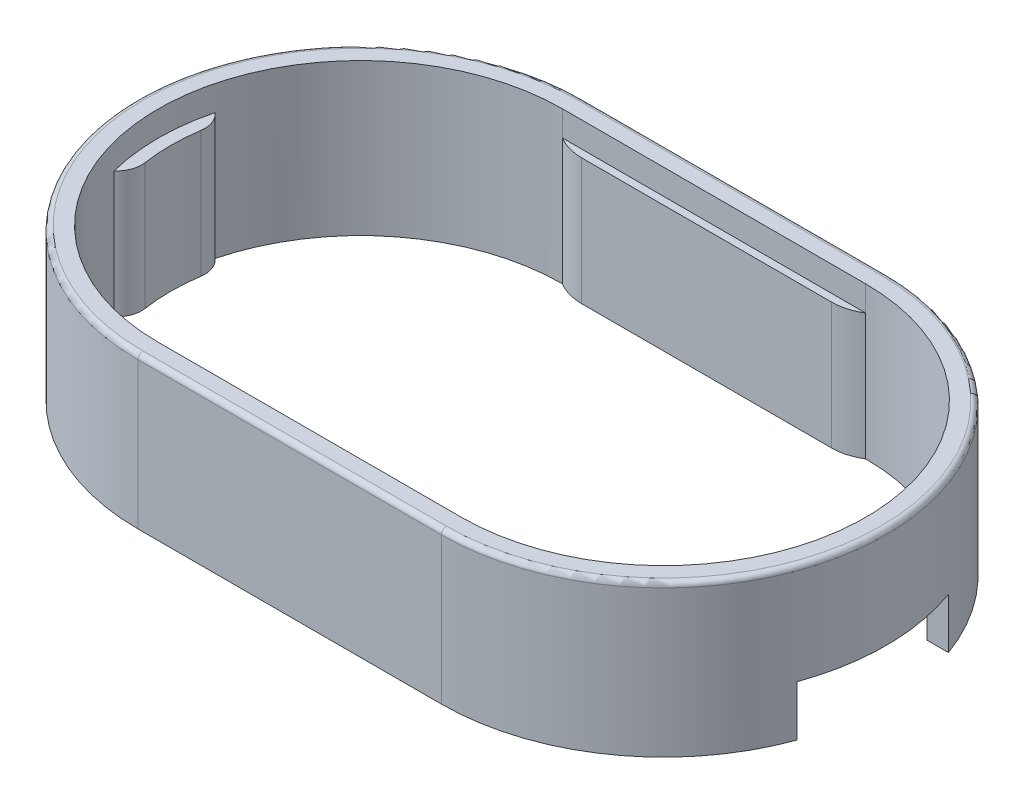
ISO-10303-21;
HEADER;
FILE_DESCRIPTION(('STEP AP214'),'2;1');
FILE_NAME('part.step','',(''),(''),'','','');
FILE_SCHEMA(('AUTOMOTIVE_DESIGN { 1 0 10303 214 1 1 1 1 }'));
ENDSEC;
DATA;
#1=APPLICATION_CONTEXT('core data for automotive mechanical design processes');
#2=APPLICATION_PROTOCOL_DEFINITION('international standard','automotive_design',2000,#1);
#3=PRODUCT_CONTEXT('',#1,'mechanical');
#4=PRODUCT('Part','Part','',(#3));
#5=PRODUCT_RELATED_PRODUCT_CATEGORY('part','',(#4));
#6=PRODUCT_DEFINITION_FORMATION('','',#4);
#7=PRODUCT_DEFINITION_CONTEXT('part definition',#1,'design');
#8=PRODUCT_DEFINITION('design','',#6,#7);
#9=PRODUCT_DEFINITION_SHAPE('','',#8);
#10=(LENGTH_UNIT() NAMED_UNIT(*) SI_UNIT(.MILLI.,.METRE.));
#11=(NAMED_UNIT(*) PLANE_ANGLE_UNIT() SI_UNIT($,.RADIAN.));
#12=(NAMED_UNIT(*) SI_UNIT($,.STERADIAN.) SOLID_ANGLE_UNIT());
#13=UNCERTAINTY_MEASURE_WITH_UNIT(LENGTH_MEASURE(1.E-05),#10,'distance_accuracy_value','');
#14=(GEOMETRIC_REPRESENTATION_CONTEXT(3) GLOBAL_UNCERTAINTY_ASSIGNED_CONTEXT((#13)) GLOBAL_UNIT_ASSIGNED_CONTEXT((#10,
#11,#12)) REPRESENTATION_CONTEXT('',''));
#15=CARTESIAN_POINT('',(0.,0.,0.));
#16=DIRECTION('',(0.,0.,1.));
#17=DIRECTION('',(1.,0.,0.));
#18=AXIS2_PLACEMENT_3D('',#15,#16,#17);
#19=CARTESIAN_POINT('',(60.,25.,-44.));
#20=DIRECTION('',(0.,-1.,0.));
#21=DIRECTION('',(0.,0.,-1.));
#22=AXIS2_PLACEMENT_3D('',#19,#20,#21);
#23=CYLINDRICAL_SURFACE('',#22,37.5);
#24=DIRECTION('',(0.,-1.,0.));
#25=VECTOR('',#24,1.);
#26=CARTESIAN_POINT('',(97.0921977987235,25.,-49.5153297689594));
#27=LINE('',#26,#25);
#28=CARTESIAN_POINT('',(97.0921977987235,25.,-49.5153297689594));
#29=VERTEX_POINT('',#28);
#30=CARTESIAN_POINT('',(97.0921977987235,10.,-49.5153297689594));
#31=VERTEX_POINT('',#30);
#32=EDGE_CURVE('E290',#29,#31,#27,.T.);
#33=ORIENTED_EDGE('',*,*,#32,.T.);
#34=CARTESIAN_POINT('',(60.,10.,-44.));
#35=DIRECTION('',(0.,-1.,0.));
#36=DIRECTION('',(0.,0.,-1.));
#37=AXIS2_PLACEMENT_3D('',#34,#35,#36);
#38=CIRCLE('',#37,37.5);
#39=CARTESIAN_POINT('',(97.0921977987235,10.,-38.4846702310405));
#40=VERTEX_POINT('',#39);
#41=EDGE_CURVE('E47',#31,#40,#38,.T.);
#42=ORIENTED_EDGE('',*,*,#41,.T.);
#43=DIRECTION('',(0.,-1.,0.));
#44=VECTOR('',#43,1.);
#45=CARTESIAN_POINT('',(97.0921977987235,25.,-38.4846702310405));
#46=LINE('',#45,#44);
#47=CARTESIAN_POINT('',(97.0921977987235,25.,-38.4846702310405));
#48=VERTEX_POINT('',#47);
#49=EDGE_CURVE('E293',#40,#48,#46,.F.);
#50=ORIENTED_EDGE('',*,*,#49,.T.);
#51=CARTESIAN_POINT('',(60.,25.,-44.));
#52=DIRECTION('',(0.,1.,0.));
#53=DIRECTION('',(0.,0.,-1.));
#54=AXIS2_PLACEMENT_3D('',#51,#52,#53);
#55=CIRCLE('',#54,37.5);
#56=EDGE_CURVE('E335',#48,#29,#55,.T.);
#57=ORIENTED_EDGE('',*,*,#56,.T.);
#58=EDGE_LOOP('',(#33,#42,#50,#57));
#59=FACE_BOUND('',#58,.T.);
#60=ADVANCED_FACE('F32',(#59),#23,.F.);
#61=CARTESIAN_POINT('',(102.037824171887,25.,-37.7492929285125));
#62=DIRECTION('',(0.,-1.,0.));
#63=DIRECTION('',(0.,0.,-1.));
#64=AXIS2_PLACEMENT_3D('',#61,#62,#63);
#65=CYLINDRICAL_SURFACE('',#64,5.);
#66=ORIENTED_EDGE('',*,*,#49,.F.);
#67=CARTESIAN_POINT('',(102.037824171887,10.,-37.7492929285125));
#68=DIRECTION('',(0.,-1.,0.));
#69=DIRECTION('',(0.,0.,-1.));
#70=AXIS2_PLACEMENT_3D('',#67,#68,#69);
#71=CIRCLE('',#70,5.);
#72=CARTESIAN_POINT('',(98.7298334620742,10.,-34.));
#73=VERTEX_POINT('',#72);
#74=EDGE_CURVE('E351',#40,#73,#71,.F.);
#75=ORIENTED_EDGE('',*,*,#74,.T.);
#76=DIRECTION('',(0.,-1.,0.));
#77=VECTOR('',#76,1.);
#78=CARTESIAN_POINT('',(98.7298334620742,25.,-34.));
#79=LINE('',#78,#77);
#80=CARTESIAN_POINT('',(98.7298334620742,25.,-34.));
#81=VERTEX_POINT('',#80);
#82=EDGE_CURVE('E350',#81,#73,#79,.T.);
#83=ORIENTED_EDGE('',*,*,#82,.F.);
#84=CARTESIAN_POINT('',(102.037824171887,25.,-37.7492929285125));
#85=DIRECTION('',(0.,-1.,0.));
#86=DIRECTION('',(0.,0.,-1.));
#87=AXIS2_PLACEMENT_3D('',#84,#85,#86);
#88=CIRCLE('',#87,5.);
#89=EDGE_CURVE('E297',#48,#81,#88,.F.);
#90=ORIENTED_EDGE('',*,*,#89,.F.);
#91=EDGE_LOOP('',(#66,#75,#83,#90));
#92=FACE_BOUND('',#91,.T.);
#93=ADVANCED_FACE('F557',(#92),#65,.T.);
#94=CARTESIAN_POINT('',(102.037824171887,30.,-50.2507070714873));
#95=DIRECTION('',(0.,-1.,0.));
#96=DIRECTION('',(0.,0.,-1.));
#97=AXIS2_PLACEMENT_3D('',#94,#95,#96);
#98=CYLINDRICAL_SURFACE('',#97,5.);
#99=DIRECTION('',(0.,-1.,0.));
#100=VECTOR('',#99,1.);
#101=CARTESIAN_POINT('',(98.7298334620742,25.,-53.9999999999999));
#102=LINE('',#101,#100);
#103=CARTESIAN_POINT('',(98.7298334620742,25.,-53.9999999999999));
#104=VERTEX_POINT('',#103);
#105=CARTESIAN_POINT('',(98.7298334620742,10.,-53.9999999999999));
#106=VERTEX_POINT('',#105);
#107=EDGE_CURVE('E475',#104,#106,#102,.T.);
#108=ORIENTED_EDGE('',*,*,#107,.T.);
#109=CARTESIAN_POINT('',(102.037824171887,10.,-50.2507070714873));
#110=DIRECTION('',(0.,-1.,0.));
#111=DIRECTION('',(0.,0.,-1.));
#112=AXIS2_PLACEMENT_3D('',#109,#110,#111);
#113=CIRCLE('',#112,5.);
#114=EDGE_CURVE('E325',#106,#31,#113,.F.);
#115=ORIENTED_EDGE('',*,*,#114,.T.);
#116=ORIENTED_EDGE('',*,*,#32,.F.);
#117=CARTESIAN_POINT('',(102.037824171887,25.,-50.2507070714873));
#118=DIRECTION('',(0.,-1.,0.));
#119=DIRECTION('',(0.,0.,-1.));
#120=AXIS2_PLACEMENT_3D('',#117,#118,#119);
#121=CIRCLE('',#120,5.);
#122=EDGE_CURVE('E295',#104,#29,#121,.F.);
#123=ORIENTED_EDGE('',*,*,#122,.F.);
#124=EDGE_LOOP('',(#108,#115,#116,#123));
#125=FACE_BOUND('',#124,.T.);
#126=ADVANCED_FACE('F487',(#125),#98,.T.);
#127=CARTESIAN_POINT('',(0.,30.,-4.));
#128=DIRECTION('',(0.,0.,-1.));
#129=DIRECTION('',(-1.,0.,0.));
#130=AXIS2_PLACEMENT_3D('',#127,#128,#129);
#131=PLANE('',#130);
#132=DIRECTION('',(0.,-1.,0.));
#133=VECTOR('',#132,1.);
#134=CARTESIAN_POINT('',(60.,30.,-4.));
#135=LINE('',#134,#133);
#136=CARTESIAN_POINT('',(60.,30.,-4.));
#137=VERTEX_POINT('',#136);
#138=CARTESIAN_POINT('',(60.,25.,-4.));
#139=VERTEX_POINT('',#138);
#140=EDGE_CURVE('E404',#137,#139,#135,.T.);
#141=ORIENTED_EDGE('',*,*,#140,.T.);
#142=DIRECTION('',(-1.,0.,0.));
#143=VECTOR('',#142,1.);
#144=CARTESIAN_POINT('',(59.9999999999999,25.,-4.));
#145=LINE('',#144,#143);
#146=CARTESIAN_POINT('',(0.,25.,-4.));
#147=VERTEX_POINT('',#146);
#148=EDGE_CURVE('E440',#139,#147,#145,.T.);
#149=ORIENTED_EDGE('',*,*,#148,.T.);
#150=DIRECTION('',(0.,1.,0.));
#151=VECTOR('',#150,1.);
#152=CARTESIAN_POINT('',(0.,30.,-4.));
#153=LINE('',#152,#151);
#154=CARTESIAN_POINT('',(0.,30.,-4.));
#155=VERTEX_POINT('',#154);
#156=EDGE_CURVE('E402',#155,#147,#153,.F.);
#157=ORIENTED_EDGE('',*,*,#156,.F.);
#158=DIRECTION('',(1.,0.,0.));
#159=VECTOR('',#158,1.);
#160=CARTESIAN_POINT('',(0.,30.,-4.));
#161=LINE('',#160,#159);
#162=EDGE_CURVE('E413',#155,#137,#161,.T.);
#163=ORIENTED_EDGE('',*,*,#162,.T.);
#164=EDGE_LOOP('',(#141,#149,#157,#163));
#165=FACE_BOUND('',#164,.T.);
#166=ADVANCED_FACE('F543',(#165),#131,.T.);
#167=CARTESIAN_POINT('',(0.,30.,-44.));
#168=DIRECTION('',(0.,-1.,0.));
#169=DIRECTION('',(0.,0.,-1.));
#170=AXIS2_PLACEMENT_3D('',#167,#168,#169);
#171=CYLINDRICAL_SURFACE('',#170,44.);
#172=DIRECTION('',(0.,-1.,0.));
#173=VECTOR('',#172,1.);
#174=CARTESIAN_POINT('',(0.,30.,0.));
#175=LINE('',#174,#173);
#176=CARTESIAN_POINT('',(0.,29.,0.));
#177=VERTEX_POINT('',#176);
#178=CARTESIAN_POINT('',(0.,0.,0.));
#179=VERTEX_POINT('',#178);
#180=EDGE_CURVE('E258',#177,#179,#175,.T.);
#181=ORIENTED_EDGE('',*,*,#180,.F.);
#182=CARTESIAN_POINT('',(0.,29.,-44.));
#183=DIRECTION('',(0.,1.,0.));
#184=DIRECTION('',(0.,0.,1.));
#185=AXIS2_PLACEMENT_3D('',#182,#183,#184);
#186=CIRCLE('',#185,44.);
#187=CARTESIAN_POINT('',(0.,29.,-88.));
#188=VERTEX_POINT('',#187);
#189=EDGE_CURVE('E323',#177,#188,#186,.F.);
#190=ORIENTED_EDGE('',*,*,#189,.T.);
#191=DIRECTION('',(0.,-1.,0.));
#192=VECTOR('',#191,1.);
#193=CARTESIAN_POINT('',(0.,30.,-88.));
#194=LINE('',#193,#192);
#195=CARTESIAN_POINT('',(0.,0.,-88.));
#196=VERTEX_POINT('',#195);
#197=EDGE_CURVE('E247',#188,#196,#194,.T.);
#198=ORIENTED_EDGE('',*,*,#197,.T.);
#199=CARTESIAN_POINT('',(0.,0.,-44.));
#200=DIRECTION('',(0.,1.,0.));
#201=DIRECTION('',(0.,0.,1.));
#202=AXIS2_PLACEMENT_3D('',#199,#200,#201);
#203=CIRCLE('',#202,44.);
#204=EDGE_CURVE('E376',#196,#179,#203,.T.);
#205=ORIENTED_EDGE('',*,*,#204,.T.);
#206=EDGE_LOOP('',(#181,#190,#198,#205));
#207=FACE_BOUND('',#206,.T.);
#208=ADVANCED_FACE('F401',(#207),#171,.T.);
#209=CARTESIAN_POINT('',(0.,30.,0.));
#210=DIRECTION('',(0.,0.,-1.));
#211=DIRECTION('',(-1.,0.,0.));
#212=AXIS2_PLACEMENT_3D('',#209,#210,#211);
#213=PLANE('',#212);
#214=DIRECTION('',(0.,-1.,0.));
#215=VECTOR('',#214,1.);
#216=CARTESIAN_POINT('',(60.,30.,0.));
#217=LINE('',#216,#215);
#218=CARTESIAN_POINT('',(60.,29.,0.));
#219=VERTEX_POINT('',#218);
#220=CARTESIAN_POINT('',(60.,0.,0.));
#221=VERTEX_POINT('',#220);
#222=EDGE_CURVE('E241',#219,#221,#217,.T.);
#223=ORIENTED_EDGE('',*,*,#222,.F.);
#224=DIRECTION('',(1.,0.,0.));
#225=VECTOR('',#224,1.);
#226=CARTESIAN_POINT('',(0.,29.,0.));
#227=LINE('',#226,#225);
#228=EDGE_CURVE('E55',#219,#177,#227,.F.);
#229=ORIENTED_EDGE('',*,*,#228,.T.);
#230=ORIENTED_EDGE('',*,*,#180,.T.);
#231=DIRECTION('',(1.,0.,0.));
#232=VECTOR('',#231,1.);
#233=CARTESIAN_POINT('',(0.,0.,0.));
#234=LINE('',#233,#232);
#235=EDGE_CURVE('E249',#179,#221,#234,.T.);
#236=ORIENTED_EDGE('',*,*,#235,.T.);
#237=EDGE_LOOP('',(#223,#229,#230,#236));
#238=FACE_BOUND('',#237,.T.);
#239=ADVANCED_FACE('F384',(#238),#213,.F.);
#240=CARTESIAN_POINT('',(60.,30.,-44.));
#241=DIRECTION('',(0.,-1.,0.));
#242=DIRECTION('',(0.,0.,-1.));
#243=AXIS2_PLACEMENT_3D('',#240,#241,#242);
#244=CYLINDRICAL_SURFACE('',#243,44.);
#245=CARTESIAN_POINT('',(60.,0.,-44.));
#246=DIRECTION('',(0.,1.,0.));
#247=DIRECTION('',(0.,0.,1.));
#248=AXIS2_PLACEMENT_3D('',#245,#246,#247);
#249=CIRCLE('',#248,44.);
#250=CARTESIAN_POINT('',(101.364235759893,0.,-29.));
#251=VERTEX_POINT('',#250);
#252=EDGE_CURVE('E235',#221,#251,#249,.T.);
#253=ORIENTED_EDGE('',*,*,#252,.T.);
#254=DIRECTION('',(0.,-1.,0.));
#255=VECTOR('',#254,1.);
#256=CARTESIAN_POINT('',(101.364235759893,30.,-29.));
#257=LINE('',#256,#255);
#258=CARTESIAN_POINT('',(101.364235759893,10.,-29.));
#259=VERTEX_POINT('',#258);
#260=EDGE_CURVE('E217',#251,#259,#257,.F.);
#261=ORIENTED_EDGE('',*,*,#260,.T.);
#262=CARTESIAN_POINT('',(60.,10.,-44.));
#263=DIRECTION('',(0.,-1.,0.));
#264=DIRECTION('',(0.,0.,-1.));
#265=AXIS2_PLACEMENT_3D('',#262,#263,#264);
#266=CIRCLE('',#265,44.);
#267=CARTESIAN_POINT('',(101.364235759893,10.,-59.));
#268=VERTEX_POINT('',#267);
#269=EDGE_CURVE('E342',#268,#259,#266,.T.);
#270=ORIENTED_EDGE('',*,*,#269,.F.);
#271=DIRECTION('',(0.,-1.,0.));
#272=VECTOR('',#271,1.);
#273=CARTESIAN_POINT('',(101.364235759893,30.,-59.));
#274=LINE('',#273,#272);
#275=CARTESIAN_POINT('',(101.364235759893,0.,-59.));
#276=VERTEX_POINT('',#275);
#277=EDGE_CURVE('E228',#268,#276,#274,.T.);
#278=ORIENTED_EDGE('',*,*,#277,.T.);
#279=CARTESIAN_POINT('',(60.,0.,-88.));
#280=VERTEX_POINT('',#279);
#281=EDGE_CURVE('E244',#276,#280,#249,.T.);
#282=ORIENTED_EDGE('',*,*,#281,.T.);
#283=DIRECTION('',(0.,-1.,0.));
#284=VECTOR('',#283,1.);
#285=CARTESIAN_POINT('',(60.,30.,-88.));
#286=LINE('',#285,#284);
#287=CARTESIAN_POINT('',(60.,29.,-88.));
#288=VERTEX_POINT('',#287);
#289=EDGE_CURVE('E254',#288,#280,#286,.T.);
#290=ORIENTED_EDGE('',*,*,#289,.F.);
#291=CARTESIAN_POINT('',(60.,29.,-44.));
#292=DIRECTION('',(0.,1.,0.));
#293=DIRECTION('',(0.,0.,1.));
#294=AXIS2_PLACEMENT_3D('',#291,#292,#293);
#295=CIRCLE('',#294,44.);
#296=EDGE_CURVE('E320',#288,#219,#295,.F.);
#297=ORIENTED_EDGE('',*,*,#296,.T.);
#298=ORIENTED_EDGE('',*,*,#222,.T.);
#299=EDGE_LOOP('',(#253,#261,#270,#278,#282,#290,#297,#298));
#300=FACE_BOUND('',#299,.T.);
#301=ADVANCED_FACE('F240',(#300),#244,.T.);
#302=CARTESIAN_POINT('',(60.,30.,-88.));
#303=DIRECTION('',(0.,0.,1.));
#304=DIRECTION('',(1.,0.,0.));
#305=AXIS2_PLACEMENT_3D('',#302,#303,#304);
#306=PLANE('',#305);
#307=ORIENTED_EDGE('',*,*,#197,.F.);
#308=DIRECTION('',(-1.,0.,0.));
#309=VECTOR('',#308,1.);
#310=CARTESIAN_POINT('',(60.,29.,-88.));
#311=LINE('',#310,#309);
#312=EDGE_CURVE('E317',#188,#288,#311,.F.);
#313=ORIENTED_EDGE('',*,*,#312,.T.);
#314=ORIENTED_EDGE('',*,*,#289,.T.);
#315=DIRECTION('',(-1.,0.,0.));
#316=VECTOR('',#315,1.);
#317=CARTESIAN_POINT('',(60.,0.,-88.));
#318=LINE('',#317,#316);
#319=EDGE_CURVE('E243',#280,#196,#318,.T.);
#320=ORIENTED_EDGE('',*,*,#319,.T.);
#321=EDGE_LOOP('',(#307,#313,#314,#320));
#322=FACE_BOUND('',#321,.T.);
#323=ADVANCED_FACE('F379',(#322),#306,.F.);
#324=CARTESIAN_POINT('',(0.,30.,-44.));
#325=DIRECTION('',(0.,1.,0.));
#326=DIRECTION('',(0.,0.,1.));
#327=AXIS2_PLACEMENT_3D('',#324,#325,#326);
#328=PLANE('',#327);
#329=CARTESIAN_POINT('',(60.,30.,-44.));
#330=DIRECTION('',(0.,1.,0.));
#331=DIRECTION('',(0.,0.,1.));
#332=AXIS2_PLACEMENT_3D('',#329,#330,#331);
#333=CIRCLE('',#332,43.);
#334=CARTESIAN_POINT('',(60.,30.,-1.));
#335=VERTEX_POINT('',#334);
#336=CARTESIAN_POINT('',(60.,30.,-87.));
#337=VERTEX_POINT('',#336);
#338=EDGE_CURVE('E312',#335,#337,#333,.T.);
#339=ORIENTED_EDGE('',*,*,#338,.T.);
#340=DIRECTION('',(-1.,0.,0.));
#341=VECTOR('',#340,1.);
#342=CARTESIAN_POINT('',(0.,30.,-87.));
#343=LINE('',#342,#341);
#344=CARTESIAN_POINT('',(0.,30.,-87.));
#345=VERTEX_POINT('',#344);
#346=EDGE_CURVE('E314',#337,#345,#343,.T.);
#347=ORIENTED_EDGE('',*,*,#346,.T.);
#348=CARTESIAN_POINT('',(0.,30.,-44.));
#349=DIRECTION('',(0.,1.,0.));
#350=DIRECTION('',(0.,0.,1.));
#351=AXIS2_PLACEMENT_3D('',#348,#349,#350);
#352=CIRCLE('',#351,43.);
#353=CARTESIAN_POINT('',(0.,30.,-1.));
#354=VERTEX_POINT('',#353);
#355=EDGE_CURVE('E308',#345,#354,#352,.T.);
#356=ORIENTED_EDGE('',*,*,#355,.T.);
#357=DIRECTION('',(1.,0.,0.));
#358=VECTOR('',#357,1.);
#359=CARTESIAN_POINT('',(60.,30.,-1.));
#360=LINE('',#359,#358);
#361=EDGE_CURVE('E310',#354,#335,#360,.T.);
#362=ORIENTED_EDGE('',*,*,#361,.T.);
#363=EDGE_LOOP('',(#339,#347,#356,#362));
#364=FACE_BOUND('',#363,.T.);
#365=CARTESIAN_POINT('',(0.,30.,-44.));
#366=DIRECTION('',(0.,1.,0.));
#367=DIRECTION('',(0.,0.,1.));
#368=AXIS2_PLACEMENT_3D('',#365,#366,#367);
#369=CIRCLE('',#368,40.);
#370=CARTESIAN_POINT('',(0.,30.,-84.));
#371=VERTEX_POINT('',#370);
#372=EDGE_CURVE('E415',#371,#155,#369,.T.);
#373=ORIENTED_EDGE('',*,*,#372,.F.);
#374=DIRECTION('',(-1.,0.,0.));
#375=VECTOR('',#374,1.);
#376=CARTESIAN_POINT('',(60.,30.,-84.));
#377=LINE('',#376,#375);
#378=CARTESIAN_POINT('',(60.,30.,-84.));
#379=VERTEX_POINT('',#378);
#380=EDGE_CURVE('E407',#379,#371,#377,.T.);
#381=ORIENTED_EDGE('',*,*,#380,.F.);
#382=CARTESIAN_POINT('',(60.,30.,-44.));
#383=DIRECTION('',(0.,1.,0.));
#384=DIRECTION('',(0.,0.,1.));
#385=AXIS2_PLACEMENT_3D('',#382,#383,#384);
#386=CIRCLE('',#385,40.);
#387=EDGE_CURVE('E410',#137,#379,#386,.T.);
#388=ORIENTED_EDGE('',*,*,#387,.F.);
#389=ORIENTED_EDGE('',*,*,#162,.F.);
#390=EDGE_LOOP('',(#373,#381,#388,#389));
#391=FACE_BOUND('',#390,.T.);
#392=ADVANCED_FACE('F394',(#364,#391),#328,.T.);
#393=CARTESIAN_POINT('',(0.,0.,-44.));
#394=DIRECTION('',(0.,1.,0.));
#395=DIRECTION('',(0.,0.,1.));
#396=AXIS2_PLACEMENT_3D('',#393,#394,#395);
#397=PLANE('',#396);
#398=CARTESIAN_POINT('',(60.,0.,-44.));
#399=DIRECTION('',(0.,1.,0.));
#400=DIRECTION('',(0.,0.,1.));
#401=AXIS2_PLACEMENT_3D('',#398,#399,#400);
#402=CIRCLE('',#401,40.);
#403=CARTESIAN_POINT('',(59.9999999999999,0.,-4.));
#404=VERTEX_POINT('',#403);
#405=CARTESIAN_POINT('',(97.0809924354783,0.,-29.));
#406=VERTEX_POINT('',#405);
#407=EDGE_CURVE('E237',#404,#406,#402,.T.);
#408=ORIENTED_EDGE('',*,*,#407,.T.);
#409=DIRECTION('',(-1.,0.,0.));
#410=VECTOR('',#409,1.);
#411=CARTESIAN_POINT('',(110.718118592284,0.,-29.));
#412=LINE('',#411,#410);
#413=EDGE_CURVE('E220',#251,#406,#412,.T.);
#414=ORIENTED_EDGE('',*,*,#413,.F.);
#415=ORIENTED_EDGE('',*,*,#252,.F.);
#416=ORIENTED_EDGE('',*,*,#235,.F.);
#417=ORIENTED_EDGE('',*,*,#204,.F.);
#418=ORIENTED_EDGE('',*,*,#319,.F.);
#419=ORIENTED_EDGE('',*,*,#281,.F.);
#420=DIRECTION('',(1.,0.,0.));
#421=VECTOR('',#420,1.);
#422=CARTESIAN_POINT('',(110.718118592284,0.,-59.));
#423=LINE('',#422,#421);
#424=CARTESIAN_POINT('',(97.0809924354783,0.,-59.));
#425=VERTEX_POINT('',#424);
#426=EDGE_CURVE('E238',#425,#276,#423,.T.);
#427=ORIENTED_EDGE('',*,*,#426,.F.);
#428=CARTESIAN_POINT('',(60.,0.,-84.));
#429=VERTEX_POINT('',#428);
#430=EDGE_CURVE('E418',#425,#429,#402,.T.);
#431=ORIENTED_EDGE('',*,*,#430,.T.);
#432=CARTESIAN_POINT('',(54.7321731235736,0.,-92.5));
#433=DIRECTION('',(0.,1.,0.));
#434=DIRECTION('',(0.,0.,1.));
#435=AXIS2_PLACEMENT_3D('',#432,#433,#434);
#436=CIRCLE('',#435,10.);
#437=CARTESIAN_POINT('',(54.7321731235736,0.,-82.5));
#438=VERTEX_POINT('',#437);
#439=EDGE_CURVE('E269',#429,#438,#436,.F.);
#440=ORIENTED_EDGE('',*,*,#439,.T.);
#441=DIRECTION('',(-1.,0.,0.));
#442=VECTOR('',#441,1.);
#443=CARTESIAN_POINT('',(0.,0.,-82.5));
#444=LINE('',#443,#442);
#445=CARTESIAN_POINT('',(5.26782687642638,0.,-82.5));
#446=VERTEX_POINT('',#445);
#447=EDGE_CURVE('E452',#438,#446,#444,.T.);
#448=ORIENTED_EDGE('',*,*,#447,.T.);
#449=CARTESIAN_POINT('',(5.26782687642638,0.,-92.5));
#450=DIRECTION('',(0.,1.,0.));
#451=DIRECTION('',(0.,0.,1.));
#452=AXIS2_PLACEMENT_3D('',#449,#450,#451);
#453=CIRCLE('',#452,10.);
#454=CARTESIAN_POINT('',(0.,0.,-84.));
#455=VERTEX_POINT('',#454);
#456=EDGE_CURVE('E267',#446,#455,#453,.F.);
#457=ORIENTED_EDGE('',*,*,#456,.T.);
#458=CARTESIAN_POINT('',(0.,0.,-44.));
#459=DIRECTION('',(0.,1.,0.));
#460=DIRECTION('',(0.,0.,1.));
#461=AXIS2_PLACEMENT_3D('',#458,#459,#460);
#462=CIRCLE('',#461,40.);
#463=CARTESIAN_POINT('',(-38.7298334620743,0.,-54.));
#464=VERTEX_POINT('',#463);
#465=EDGE_CURVE('E419',#455,#464,#462,.T.);
#466=ORIENTED_EDGE('',*,*,#465,.T.);
#467=CARTESIAN_POINT('',(-42.0378241718867,0.,-50.2507070714875));
#468=DIRECTION('',(0.,1.,0.));
#469=DIRECTION('',(0.,0.,1.));
#470=AXIS2_PLACEMENT_3D('',#467,#468,#469);
#471=CIRCLE('',#470,5.);
#472=CARTESIAN_POINT('',(-37.0921977987236,0.,-49.5153297689595));
#473=VERTEX_POINT('',#472);
#474=EDGE_CURVE('E286',#464,#473,#471,.F.);
#475=ORIENTED_EDGE('',*,*,#474,.T.);
#476=CARTESIAN_POINT('',(0.,0.,-44.));
#477=DIRECTION('',(0.,1.,0.));
#478=DIRECTION('',(0.,0.,1.));
#479=AXIS2_PLACEMENT_3D('',#476,#477,#478);
#480=CIRCLE('',#479,37.5);
#481=CARTESIAN_POINT('',(-37.0921977987236,0.,-38.4846702310406));
#482=VERTEX_POINT('',#481);
#483=EDGE_CURVE('E467',#473,#482,#480,.T.);
#484=ORIENTED_EDGE('',*,*,#483,.T.);
#485=CARTESIAN_POINT('',(-42.0378241718867,0.,-37.7492929285126));
#486=DIRECTION('',(0.,1.,0.));
#487=DIRECTION('',(0.,0.,1.));
#488=AXIS2_PLACEMENT_3D('',#485,#486,#487);
#489=CIRCLE('',#488,5.);
#490=CARTESIAN_POINT('',(-38.7298334620742,0.,-34.0000000000001));
#491=VERTEX_POINT('',#490);
#492=EDGE_CURVE('E288',#482,#491,#489,.F.);
#493=ORIENTED_EDGE('',*,*,#492,.T.);
#494=CARTESIAN_POINT('',(0.,0.,-4.));
#495=VERTEX_POINT('',#494);
#496=EDGE_CURVE('E422',#491,#495,#462,.T.);
#497=ORIENTED_EDGE('',*,*,#496,.T.);
#498=CARTESIAN_POINT('',(5.26782687642636,0.,4.5));
#499=DIRECTION('',(0.,1.,0.));
#500=DIRECTION('',(0.,0.,1.));
#501=AXIS2_PLACEMENT_3D('',#498,#499,#500);
#502=CIRCLE('',#501,10.);
#503=CARTESIAN_POINT('',(5.26782687642636,0.,-5.5));
#504=VERTEX_POINT('',#503);
#505=EDGE_CURVE('E265',#495,#504,#502,.F.);
#506=ORIENTED_EDGE('',*,*,#505,.T.);
#507=DIRECTION('',(1.,0.,0.));
#508=VECTOR('',#507,1.);
#509=CARTESIAN_POINT('',(0.,0.,-5.5));
#510=LINE('',#509,#508);
#511=CARTESIAN_POINT('',(54.7321731235735,0.,-5.5));
#512=VERTEX_POINT('',#511);
#513=EDGE_CURVE('E437',#504,#512,#510,.T.);
#514=ORIENTED_EDGE('',*,*,#513,.T.);
#515=CARTESIAN_POINT('',(54.7321731235735,0.,4.5));
#516=DIRECTION('',(0.,1.,0.));
#517=DIRECTION('',(0.,0.,1.));
#518=AXIS2_PLACEMENT_3D('',#515,#516,#517);
#519=CIRCLE('',#518,10.);
#520=EDGE_CURVE('E271',#512,#404,#519,.F.);
#521=ORIENTED_EDGE('',*,*,#520,.T.);
#522=EDGE_LOOP('',(#408,#414,#415,#416,#417,#418,#419,#427,#431,#440,#448,#457,#466,#475,#484,
#493,#497,#506,#514,#521));
#523=FACE_BOUND('',#522,.T.);
#524=ADVANCED_FACE('F233',(#523),#397,.F.);
#525=CARTESIAN_POINT('',(0.,30.,-44.));
#526=DIRECTION('',(0.,-1.,0.));
#527=DIRECTION('',(0.,0.,-1.));
#528=AXIS2_PLACEMENT_3D('',#525,#526,#527);
#529=CYLINDRICAL_SURFACE('',#528,40.);
#530=DIRECTION('',(0.,-1.,0.));
#531=VECTOR('',#530,1.);
#532=CARTESIAN_POINT('',(-38.7298334620743,25.,-54.));
#533=LINE('',#532,#531);
#534=CARTESIAN_POINT('',(-38.7298334620743,25.,-54.));
#535=VERTEX_POINT('',#534);
#536=EDGE_CURVE('E456',#535,#464,#533,.T.);
#537=ORIENTED_EDGE('',*,*,#536,.T.);
#538=ORIENTED_EDGE('',*,*,#465,.F.);
#539=DIRECTION('',(0.,-1.,0.));
#540=VECTOR('',#539,1.);
#541=CARTESIAN_POINT('',(0.,25.,-84.));
#542=LINE('',#541,#540);
#543=CARTESIAN_POINT('',(0.,25.,-84.));
#544=VERTEX_POINT('',#543);
#545=EDGE_CURVE('E441',#544,#455,#542,.T.);
#546=ORIENTED_EDGE('',*,*,#545,.F.);
#547=DIRECTION('',(0.,-1.,0.));
#548=VECTOR('',#547,1.);
#549=CARTESIAN_POINT('',(0.,30.,-84.));
#550=LINE('',#549,#548);
#551=EDGE_CURVE('E409',#371,#544,#550,.T.);
#552=ORIENTED_EDGE('',*,*,#551,.F.);
#553=ORIENTED_EDGE('',*,*,#372,.T.);
#554=ORIENTED_EDGE('',*,*,#156,.T.);
#555=DIRECTION('',(0.,-1.,0.));
#556=VECTOR('',#555,1.);
#557=CARTESIAN_POINT('',(0.,25.,-4.));
#558=LINE('',#557,#556);
#559=EDGE_CURVE('E430',#147,#495,#558,.T.);
#560=ORIENTED_EDGE('',*,*,#559,.T.);
#561=ORIENTED_EDGE('',*,*,#496,.F.);
#562=DIRECTION('',(0.,-1.,0.));
#563=VECTOR('',#562,1.);
#564=CARTESIAN_POINT('',(-38.7298334620743,25.,-34.0000000000001));
#565=LINE('',#564,#563);
#566=CARTESIAN_POINT('',(-38.7298334620743,25.,-34.0000000000001));
#567=VERTEX_POINT('',#566);
#568=EDGE_CURVE('E461',#567,#491,#565,.T.);
#569=ORIENTED_EDGE('',*,*,#568,.F.);
#570=CARTESIAN_POINT('',(0.,25.,-44.));
#571=DIRECTION('',(0.,-1.,0.));
#572=DIRECTION('',(0.,0.,1.));
#573=AXIS2_PLACEMENT_3D('',#570,#571,#572);
#574=CIRCLE('',#573,40.);
#575=EDGE_CURVE('E464',#567,#535,#574,.T.);
#576=ORIENTED_EDGE('',*,*,#575,.T.);
#577=EDGE_LOOP('',(#537,#538,#546,#552,#553,#554,#560,#561,#569,#576));
#578=FACE_BOUND('',#577,.T.);
#579=ADVANCED_FACE('F507',(#578),#529,.F.);
#580=CARTESIAN_POINT('',(60.,30.,-44.));
#581=DIRECTION('',(0.,-1.,0.));
#582=DIRECTION('',(0.,0.,-1.));
#583=AXIS2_PLACEMENT_3D('',#580,#581,#582);
#584=CYLINDRICAL_SURFACE('',#583,40.);
#585=DIRECTION('',(0.,-1.,0.));
#586=VECTOR('',#585,1.);
#587=CARTESIAN_POINT('',(97.0809924354783,30.,-59.));
#588=LINE('',#587,#586);
#589=CARTESIAN_POINT('',(97.0809924354783,10.,-59.));
#590=VERTEX_POINT('',#589);
#591=EDGE_CURVE('E11',#590,#425,#588,.T.);
#592=ORIENTED_EDGE('',*,*,#591,.F.);
#593=CARTESIAN_POINT('',(60.,10.,-44.));
#594=DIRECTION('',(0.,-1.,0.));
#595=DIRECTION('',(0.,0.,-1.));
#596=AXIS2_PLACEMENT_3D('',#593,#594,#595);
#597=CIRCLE('',#596,40.);
#598=EDGE_CURVE('E353',#590,#106,#597,.T.);
#599=ORIENTED_EDGE('',*,*,#598,.T.);
#600=ORIENTED_EDGE('',*,*,#107,.F.);
#601=CARTESIAN_POINT('',(60.,25.,-44.));
#602=DIRECTION('',(0.,-1.,0.));
#603=DIRECTION('',(0.,0.,-1.));
#604=AXIS2_PLACEMENT_3D('',#601,#602,#603);
#605=CIRCLE('',#604,40.);
#606=EDGE_CURVE('E477',#104,#81,#605,.T.);
#607=ORIENTED_EDGE('',*,*,#606,.T.);
#608=ORIENTED_EDGE('',*,*,#82,.T.);
#609=CARTESIAN_POINT('',(97.0809924354783,10.,-29.));
#610=VERTEX_POINT('',#609);
#611=EDGE_CURVE('E339',#73,#610,#597,.T.);
#612=ORIENTED_EDGE('',*,*,#611,.T.);
#613=DIRECTION('',(0.,-1.,0.));
#614=VECTOR('',#613,1.);
#615=CARTESIAN_POINT('',(97.0809924354783,30.,-29.));
#616=LINE('',#615,#614);
#617=EDGE_CURVE('E40',#406,#610,#616,.F.);
#618=ORIENTED_EDGE('',*,*,#617,.F.);
#619=ORIENTED_EDGE('',*,*,#407,.F.);
#620=DIRECTION('',(0.,-1.,0.));
#621=VECTOR('',#620,1.);
#622=CARTESIAN_POINT('',(59.9999999999999,25.,-4.));
#623=LINE('',#622,#621);
#624=EDGE_CURVE('E433',#139,#404,#623,.T.);
#625=ORIENTED_EDGE('',*,*,#624,.F.);
#626=ORIENTED_EDGE('',*,*,#140,.F.);
#627=ORIENTED_EDGE('',*,*,#387,.T.);
#628=DIRECTION('',(0.,1.,0.));
#629=VECTOR('',#628,1.);
#630=CARTESIAN_POINT('',(60.,30.,-84.));
#631=LINE('',#630,#629);
#632=CARTESIAN_POINT('',(60.,25.,-84.));
#633=VERTEX_POINT('',#632);
#634=EDGE_CURVE('E423',#379,#633,#631,.F.);
#635=ORIENTED_EDGE('',*,*,#634,.T.);
#636=DIRECTION('',(0.,-1.,0.));
#637=VECTOR('',#636,1.);
#638=CARTESIAN_POINT('',(60.,25.,-84.));
#639=LINE('',#638,#637);
#640=EDGE_CURVE('E446',#633,#429,#639,.T.);
#641=ORIENTED_EDGE('',*,*,#640,.T.);
#642=ORIENTED_EDGE('',*,*,#430,.F.);
#643=EDGE_LOOP('',(#592,#599,#600,#607,#608,#612,#618,#619,#625,#626,#627,#635,#641,#642));
#644=FACE_BOUND('',#643,.T.);
#645=ADVANCED_FACE('F347',(#644),#584,.F.);
#646=CARTESIAN_POINT('',(60.,30.,-84.));
#647=DIRECTION('',(0.,0.,1.));
#648=DIRECTION('',(1.,0.,0.));
#649=AXIS2_PLACEMENT_3D('',#646,#647,#648);
#650=PLANE('',#649);
#651=DIRECTION('',(1.,0.,0.));
#652=VECTOR('',#651,1.);
#653=CARTESIAN_POINT('',(60.,25.,-84.));
#654=LINE('',#653,#652);
#655=EDGE_CURVE('E455',#544,#633,#654,.T.);
#656=ORIENTED_EDGE('',*,*,#655,.T.);
#657=ORIENTED_EDGE('',*,*,#634,.F.);
#658=ORIENTED_EDGE('',*,*,#380,.T.);
#659=ORIENTED_EDGE('',*,*,#551,.T.);
#660=EDGE_LOOP('',(#656,#657,#658,#659));
#661=FACE_BOUND('',#660,.T.);
#662=ADVANCED_FACE('F554',(#661),#650,.T.);
#663=CARTESIAN_POINT('',(0.,25.,-5.5));
#664=DIRECTION('',(0.,0.,-1.));
#665=DIRECTION('',(-1.,0.,0.));
#666=AXIS2_PLACEMENT_3D('',#663,#664,#665);
#667=PLANE('',#666);
#668=DIRECTION('',(1.,0.,0.));
#669=VECTOR('',#668,1.);
#670=CARTESIAN_POINT('',(0.,25.,-5.5));
#671=LINE('',#670,#669);
#672=CARTESIAN_POINT('',(5.26782687642636,25.,-5.5));
#673=VERTEX_POINT('',#672);
#674=CARTESIAN_POINT('',(54.7321731235735,25.,-5.5));
#675=VERTEX_POINT('',#674);
#676=EDGE_CURVE('E434',#673,#675,#671,.T.);
#677=ORIENTED_EDGE('',*,*,#676,.T.);
#678=DIRECTION('',(0.,1.,0.));
#679=VECTOR('',#678,1.);
#680=CARTESIAN_POINT('',(54.7321731235735,0.,-5.5));
#681=LINE('',#680,#679);
#682=EDGE_CURVE('E262',#675,#512,#681,.F.);
#683=ORIENTED_EDGE('',*,*,#682,.T.);
#684=ORIENTED_EDGE('',*,*,#513,.F.);
#685=DIRECTION('',(0.,1.,0.));
#686=VECTOR('',#685,1.);
#687=CARTESIAN_POINT('',(5.26782687642636,25.,-5.5));
#688=LINE('',#687,#686);
#689=EDGE_CURVE('E260',#504,#673,#688,.T.);
#690=ORIENTED_EDGE('',*,*,#689,.T.);
#691=EDGE_LOOP('',(#677,#683,#684,#690));
#692=FACE_BOUND('',#691,.T.);
#693=ADVANCED_FACE('F533',(#692),#667,.T.);
#694=CARTESIAN_POINT('',(0.,25.,0.));
#695=DIRECTION('',(0.,-1.,0.));
#696=DIRECTION('',(0.,0.,-1.));
#697=AXIS2_PLACEMENT_3D('',#694,#695,#696);
#698=PLANE('',#697);
#699=ORIENTED_EDGE('',*,*,#148,.F.);
#700=CARTESIAN_POINT('',(54.7321731235735,25.,4.5));
#701=DIRECTION('',(0.,-1.,0.));
#702=DIRECTION('',(0.,0.,-1.));
#703=AXIS2_PLACEMENT_3D('',#700,#701,#702);
#704=CIRCLE('',#703,10.);
#705=EDGE_CURVE('E275',#139,#675,#704,.F.);
#706=ORIENTED_EDGE('',*,*,#705,.T.);
#707=ORIENTED_EDGE('',*,*,#676,.F.);
#708=CARTESIAN_POINT('',(5.26782687642636,25.,4.5));
#709=DIRECTION('',(0.,-1.,0.));
#710=DIRECTION('',(0.,0.,-1.));
#711=AXIS2_PLACEMENT_3D('',#708,#709,#710);
#712=CIRCLE('',#711,10.);
#713=EDGE_CURVE('E273',#673,#147,#712,.F.);
#714=ORIENTED_EDGE('',*,*,#713,.T.);
#715=EDGE_LOOP('',(#699,#706,#707,#714));
#716=FACE_BOUND('',#715,.T.);
#717=ADVANCED_FACE('F546',(#716),#698,.F.);
#718=CARTESIAN_POINT('',(0.,25.,-82.5));
#719=DIRECTION('',(0.,0.,1.));
#720=DIRECTION('',(1.,0.,0.));
#721=AXIS2_PLACEMENT_3D('',#718,#719,#720);
#722=PLANE('',#721);
#723=ORIENTED_EDGE('',*,*,#447,.F.);
#724=DIRECTION('',(0.,1.,0.));
#725=VECTOR('',#724,1.);
#726=CARTESIAN_POINT('',(54.7321731235736,25.,-82.5));
#727=LINE('',#726,#725);
#728=CARTESIAN_POINT('',(54.7321731235736,25.,-82.5));
#729=VERTEX_POINT('',#728);
#730=EDGE_CURVE('E280',#438,#729,#727,.T.);
#731=ORIENTED_EDGE('',*,*,#730,.T.);
#732=DIRECTION('',(-1.,0.,0.));
#733=VECTOR('',#732,1.);
#734=CARTESIAN_POINT('',(0.,25.,-82.5));
#735=LINE('',#734,#733);
#736=CARTESIAN_POINT('',(5.26782687642638,25.,-82.5));
#737=VERTEX_POINT('',#736);
#738=EDGE_CURVE('E449',#729,#737,#735,.T.);
#739=ORIENTED_EDGE('',*,*,#738,.T.);
#740=DIRECTION('',(0.,1.,0.));
#741=VECTOR('',#740,1.);
#742=CARTESIAN_POINT('',(5.26782687642638,0.,-82.5));
#743=LINE('',#742,#741);
#744=EDGE_CURVE('E277',#737,#446,#743,.F.);
#745=ORIENTED_EDGE('',*,*,#744,.T.);
#746=EDGE_LOOP('',(#723,#731,#739,#745));
#747=FACE_BOUND('',#746,.T.);
#748=ADVANCED_FACE('F497',(#747),#722,.T.);
#749=CARTESIAN_POINT('',(0.,25.,0.));
#750=DIRECTION('',(0.,1.,0.));
#751=DIRECTION('',(0.,0.,1.));
#752=AXIS2_PLACEMENT_3D('',#749,#750,#751);
#753=PLANE('',#752);
#754=ORIENTED_EDGE('',*,*,#738,.F.);
#755=CARTESIAN_POINT('',(54.7321731235736,25.,-92.5));
#756=DIRECTION('',(0.,1.,0.));
#757=DIRECTION('',(0.,0.,1.));
#758=AXIS2_PLACEMENT_3D('',#755,#756,#757);
#759=CIRCLE('',#758,10.);
#760=EDGE_CURVE('E284',#729,#633,#759,.T.);
#761=ORIENTED_EDGE('',*,*,#760,.T.);
#762=ORIENTED_EDGE('',*,*,#655,.F.);
#763=CARTESIAN_POINT('',(5.26782687642638,25.,-92.5));
#764=DIRECTION('',(0.,1.,0.));
#765=DIRECTION('',(0.,0.,1.));
#766=AXIS2_PLACEMENT_3D('',#763,#764,#765);
#767=CIRCLE('',#766,10.);
#768=EDGE_CURVE('E282',#544,#737,#767,.T.);
#769=ORIENTED_EDGE('',*,*,#768,.T.);
#770=EDGE_LOOP('',(#754,#761,#762,#769));
#771=FACE_BOUND('',#770,.T.);
#772=ADVANCED_FACE('F500',(#771),#753,.T.);
#773=CARTESIAN_POINT('',(54.7321731235735,30.,4.5));
#774=DIRECTION('',(0.,-1.,0.));
#775=DIRECTION('',(0.,0.,-1.));
#776=AXIS2_PLACEMENT_3D('',#773,#774,#775);
#777=CYLINDRICAL_SURFACE('',#776,10.);
#778=ORIENTED_EDGE('',*,*,#705,.F.);
#779=ORIENTED_EDGE('',*,*,#624,.T.);
#780=ORIENTED_EDGE('',*,*,#520,.F.);
#781=ORIENTED_EDGE('',*,*,#682,.F.);
#782=EDGE_LOOP('',(#778,#779,#780,#781));
#783=FACE_BOUND('',#782,.T.);
#784=ADVANCED_FACE('F538',(#783),#777,.T.);
#785=CARTESIAN_POINT('',(54.7321731235736,30.,-92.5));
#786=DIRECTION('',(0.,-1.,0.));
#787=DIRECTION('',(0.,0.,-1.));
#788=AXIS2_PLACEMENT_3D('',#785,#786,#787);
#789=CYLINDRICAL_SURFACE('',#788,10.);
#790=ORIENTED_EDGE('',*,*,#760,.F.);
#791=ORIENTED_EDGE('',*,*,#730,.F.);
#792=ORIENTED_EDGE('',*,*,#439,.F.);
#793=ORIENTED_EDGE('',*,*,#640,.F.);
#794=EDGE_LOOP('',(#790,#791,#792,#793));
#795=FACE_BOUND('',#794,.T.);
#796=ADVANCED_FACE('F494',(#795),#789,.T.);
#797=CARTESIAN_POINT('',(5.26782687642638,30.,-92.5));
#798=DIRECTION('',(0.,-1.,0.));
#799=DIRECTION('',(0.,0.,-1.));
#800=AXIS2_PLACEMENT_3D('',#797,#798,#799);
#801=CYLINDRICAL_SURFACE('',#800,10.);
#802=ORIENTED_EDGE('',*,*,#768,.F.);
#803=ORIENTED_EDGE('',*,*,#545,.T.);
#804=ORIENTED_EDGE('',*,*,#456,.F.);
#805=ORIENTED_EDGE('',*,*,#744,.F.);
#806=EDGE_LOOP('',(#802,#803,#804,#805));
#807=FACE_BOUND('',#806,.T.);
#808=ADVANCED_FACE('F504',(#807),#801,.T.);
#809=CARTESIAN_POINT('',(5.26782687642636,30.,4.5));
#810=DIRECTION('',(0.,-1.,0.));
#811=DIRECTION('',(0.,0.,-1.));
#812=AXIS2_PLACEMENT_3D('',#809,#810,#811);
#813=CYLINDRICAL_SURFACE('',#812,10.);
#814=ORIENTED_EDGE('',*,*,#713,.F.);
#815=ORIENTED_EDGE('',*,*,#689,.F.);
#816=ORIENTED_EDGE('',*,*,#505,.F.);
#817=ORIENTED_EDGE('',*,*,#559,.F.);
#818=EDGE_LOOP('',(#814,#815,#816,#817));
#819=FACE_BOUND('',#818,.T.);
#820=ADVANCED_FACE('F529',(#819),#813,.T.);
#821=CARTESIAN_POINT('',(0.,25.,-44.));
#822=DIRECTION('',(0.,-1.,0.));
#823=DIRECTION('',(0.,0.,-1.));
#824=AXIS2_PLACEMENT_3D('',#821,#822,#823);
#825=CYLINDRICAL_SURFACE('',#824,37.5);
#826=CARTESIAN_POINT('',(0.,25.,-44.));
#827=DIRECTION('',(0.,1.,0.));
#828=DIRECTION('',(0.,0.,1.));
#829=AXIS2_PLACEMENT_3D('',#826,#827,#828);
#830=CIRCLE('',#829,37.5);
#831=CARTESIAN_POINT('',(-37.0921977987236,25.,-49.5153297689595));
#832=VERTEX_POINT('',#831);
#833=CARTESIAN_POINT('',(-37.0921977987236,25.,-38.4846702310406));
#834=VERTEX_POINT('',#833);
#835=EDGE_CURVE('E470',#832,#834,#830,.T.);
#836=ORIENTED_EDGE('',*,*,#835,.T.);
#837=DIRECTION('',(0.,-1.,0.));
#838=VECTOR('',#837,1.);
#839=CARTESIAN_POINT('',(-37.0921977987236,25.,-38.4846702310406));
#840=LINE('',#839,#838);
#841=EDGE_CURVE('E301',#834,#482,#840,.T.);
#842=ORIENTED_EDGE('',*,*,#841,.T.);
#843=ORIENTED_EDGE('',*,*,#483,.F.);
#844=DIRECTION('',(0.,-1.,0.));
#845=VECTOR('',#844,1.);
#846=CARTESIAN_POINT('',(-37.0921977987236,25.,-49.5153297689595));
#847=LINE('',#846,#845);
#848=EDGE_CURVE('E299',#473,#832,#847,.F.);
#849=ORIENTED_EDGE('',*,*,#848,.T.);
#850=EDGE_LOOP('',(#836,#842,#843,#849));
#851=FACE_BOUND('',#850,.T.);
#852=ADVANCED_FACE('F517',(#851),#825,.F.);
#853=CARTESIAN_POINT('',(0.,25.,-44.));
#854=DIRECTION('',(0.,1.,0.));
#855=DIRECTION('',(0.,0.,1.));
#856=AXIS2_PLACEMENT_3D('',#853,#854,#855);
#857=PLANE('',#856);
#858=ORIENTED_EDGE('',*,*,#575,.F.);
#859=CARTESIAN_POINT('',(-42.0378241718867,25.,-37.7492929285126));
#860=DIRECTION('',(0.,1.,0.));
#861=DIRECTION('',(0.,0.,1.));
#862=AXIS2_PLACEMENT_3D('',#859,#860,#861);
#863=CIRCLE('',#862,5.);
#864=EDGE_CURVE('E306',#567,#834,#863,.T.);
#865=ORIENTED_EDGE('',*,*,#864,.T.);
#866=ORIENTED_EDGE('',*,*,#835,.F.);
#867=CARTESIAN_POINT('',(-42.0378241718867,25.,-50.2507070714875));
#868=DIRECTION('',(0.,1.,0.));
#869=DIRECTION('',(0.,0.,1.));
#870=AXIS2_PLACEMENT_3D('',#867,#868,#869);
#871=CIRCLE('',#870,5.);
#872=EDGE_CURVE('E304',#832,#535,#871,.T.);
#873=ORIENTED_EDGE('',*,*,#872,.T.);
#874=EDGE_LOOP('',(#858,#865,#866,#873));
#875=FACE_BOUND('',#874,.T.);
#876=ADVANCED_FACE('F568',(#875),#857,.T.);
#877=CARTESIAN_POINT('',(60.,25.,-44.));
#878=DIRECTION('',(0.,-1.,0.));
#879=DIRECTION('',(0.,0.,-1.));
#880=AXIS2_PLACEMENT_3D('',#877,#878,#879);
#881=PLANE('',#880);
#882=ORIENTED_EDGE('',*,*,#56,.F.);
#883=ORIENTED_EDGE('',*,*,#89,.T.);
#884=ORIENTED_EDGE('',*,*,#606,.F.);
#885=ORIENTED_EDGE('',*,*,#122,.T.);
#886=EDGE_LOOP('',(#882,#883,#884,#885));
#887=FACE_BOUND('',#886,.T.);
#888=ADVANCED_FACE('F566',(#887),#881,.F.);
#889=CARTESIAN_POINT('',(-42.0378241718867,30.,-37.7492929285126));
#890=DIRECTION('',(0.,-1.,0.));
#891=DIRECTION('',(0.,0.,-1.));
#892=AXIS2_PLACEMENT_3D('',#889,#890,#891);
#893=CYLINDRICAL_SURFACE('',#892,5.);
#894=ORIENTED_EDGE('',*,*,#864,.F.);
#895=ORIENTED_EDGE('',*,*,#568,.T.);
#896=ORIENTED_EDGE('',*,*,#492,.F.);
#897=ORIENTED_EDGE('',*,*,#841,.F.);
#898=EDGE_LOOP('',(#894,#895,#896,#897));
#899=FACE_BOUND('',#898,.T.);
#900=ADVANCED_FACE('F522',(#899),#893,.T.);
#901=CARTESIAN_POINT('',(-42.0378241718867,25.,-50.2507070714875));
#902=DIRECTION('',(0.,-1.,0.));
#903=DIRECTION('',(0.,0.,-1.));
#904=AXIS2_PLACEMENT_3D('',#901,#902,#903);
#905=CYLINDRICAL_SURFACE('',#904,5.);
#906=ORIENTED_EDGE('',*,*,#872,.F.);
#907=ORIENTED_EDGE('',*,*,#848,.F.);
#908=ORIENTED_EDGE('',*,*,#474,.F.);
#909=ORIENTED_EDGE('',*,*,#536,.F.);
#910=EDGE_LOOP('',(#906,#907,#908,#909));
#911=FACE_BOUND('',#910,.T.);
#912=ADVANCED_FACE('F513',(#911),#905,.T.);
#913=CARTESIAN_POINT('',(0.,29.,-1.));
#914=DIRECTION('',(-1.,0.,0.));
#915=DIRECTION('',(0.,0.,1.));
#916=AXIS2_PLACEMENT_3D('',#913,#914,#915);
#917=CYLINDRICAL_SURFACE('',#916,1.);
#918=CARTESIAN_POINT('',(0.,29.,-1.));
#919=DIRECTION('',(-1.,0.,0.));
#920=DIRECTION('',(0.,0.,1.));
#921=AXIS2_PLACEMENT_3D('',#918,#919,#920);
#922=CIRCLE('',#921,1.);
#923=EDGE_CURVE('E329',#177,#354,#922,.T.);
#924=ORIENTED_EDGE('',*,*,#923,.F.);
#925=ORIENTED_EDGE('',*,*,#228,.F.);
#926=CARTESIAN_POINT('',(60.,29.,-1.));
#927=DIRECTION('',(1.,0.,0.));
#928=DIRECTION('',(0.,0.,-1.));
#929=AXIS2_PLACEMENT_3D('',#926,#927,#928);
#930=CIRCLE('',#929,1.);
#931=EDGE_CURVE('E332',#335,#219,#930,.T.);
#932=ORIENTED_EDGE('',*,*,#931,.F.);
#933=ORIENTED_EDGE('',*,*,#361,.F.);
#934=EDGE_LOOP('',(#924,#925,#932,#933));
#935=FACE_BOUND('',#934,.T.);
#936=ADVANCED_FACE('F34',(#935),#917,.T.);
#937=CARTESIAN_POINT('',(60.,29.,-44.));
#938=DIRECTION('',(0.,1.,0.));
#939=DIRECTION('',(0.,0.,1.));
#940=AXIS2_PLACEMENT_3D('',#937,#938,#939);
#941=TOROIDAL_SURFACE('',#940,43.,1.);
#942=ORIENTED_EDGE('',*,*,#931,.T.);
#943=ORIENTED_EDGE('',*,*,#296,.F.);
#944=CARTESIAN_POINT('',(60.,29.,-87.));
#945=DIRECTION('',(-1.,0.,0.));
#946=DIRECTION('',(0.,0.,1.));
#947=AXIS2_PLACEMENT_3D('',#944,#945,#946);
#948=CIRCLE('',#947,1.);
#949=EDGE_CURVE('E327',#337,#288,#948,.T.);
#950=ORIENTED_EDGE('',*,*,#949,.F.);
#951=ORIENTED_EDGE('',*,*,#338,.F.);
#952=EDGE_LOOP('',(#942,#943,#950,#951));
#953=FACE_BOUND('',#952,.T.);
#954=ADVANCED_FACE('F391',(#953),#941,.T.);
#955=CARTESIAN_POINT('',(0.,29.,-44.));
#956=DIRECTION('',(0.,1.,0.));
#957=DIRECTION('',(0.,0.,1.));
#958=AXIS2_PLACEMENT_3D('',#955,#956,#957);
#959=TOROIDAL_SURFACE('',#958,43.,1.);
#960=ORIENTED_EDGE('',*,*,#923,.T.);
#961=ORIENTED_EDGE('',*,*,#355,.F.);
#962=CARTESIAN_POINT('',(0.,29.,-87.));
#963=DIRECTION('',(1.,0.,0.));
#964=DIRECTION('',(0.,0.,-1.));
#965=AXIS2_PLACEMENT_3D('',#962,#963,#964);
#966=CIRCLE('',#965,1.);
#967=EDGE_CURVE('E227',#188,#345,#966,.T.);
#968=ORIENTED_EDGE('',*,*,#967,.F.);
#969=ORIENTED_EDGE('',*,*,#189,.F.);
#970=EDGE_LOOP('',(#960,#961,#968,#969));
#971=FACE_BOUND('',#970,.T.);
#972=ADVANCED_FACE('F398',(#971),#959,.T.);
#973=CARTESIAN_POINT('',(0.,29.,-87.));
#974=DIRECTION('',(1.,0.,0.));
#975=DIRECTION('',(0.,0.,-1.));
#976=AXIS2_PLACEMENT_3D('',#973,#974,#975);
#977=CYLINDRICAL_SURFACE('',#976,1.);
#978=ORIENTED_EDGE('',*,*,#949,.T.);
#979=ORIENTED_EDGE('',*,*,#312,.F.);
#980=ORIENTED_EDGE('',*,*,#967,.T.);
#981=ORIENTED_EDGE('',*,*,#346,.F.);
#982=EDGE_LOOP('',(#978,#979,#980,#981));
#983=FACE_BOUND('',#982,.T.);
#984=ADVANCED_FACE('F596',(#983),#977,.T.);
#985=CARTESIAN_POINT('',(110.718118592284,10.,-29.));
#986=DIRECTION('',(0.,0.,1.));
#987=DIRECTION('',(1.,0.,0.));
#988=AXIS2_PLACEMENT_3D('',#985,#986,#987);
#989=PLANE('',#988);
#990=ORIENTED_EDGE('',*,*,#413,.T.);
#991=ORIENTED_EDGE('',*,*,#617,.T.);
#992=DIRECTION('',(-1.,0.,0.));
#993=VECTOR('',#992,1.);
#994=CARTESIAN_POINT('',(110.718118592284,10.,-29.));
#995=LINE('',#994,#993);
#996=EDGE_CURVE('E223',#259,#610,#995,.T.);
#997=ORIENTED_EDGE('',*,*,#996,.F.);
#998=ORIENTED_EDGE('',*,*,#260,.F.);
#999=EDGE_LOOP('',(#990,#991,#997,#998));
#1000=FACE_BOUND('',#999,.T.);
#1001=ADVANCED_FACE('F219',(#1000),#989,.F.);
#1002=CARTESIAN_POINT('',(110.718118592284,10.,-59.));
#1003=DIRECTION('',(0.,0.,-1.));
#1004=DIRECTION('',(-1.,0.,0.));
#1005=AXIS2_PLACEMENT_3D('',#1002,#1003,#1004);
#1006=PLANE('',#1005);
#1007=DIRECTION('',(1.,0.,0.));
#1008=VECTOR('',#1007,1.);
#1009=CARTESIAN_POINT('',(110.718118592284,10.,-59.));
#1010=LINE('',#1009,#1008);
#1011=EDGE_CURVE('E343',#590,#268,#1010,.T.);
#1012=ORIENTED_EDGE('',*,*,#1011,.F.);
#1013=ORIENTED_EDGE('',*,*,#591,.T.);
#1014=ORIENTED_EDGE('',*,*,#426,.T.);
#1015=ORIENTED_EDGE('',*,*,#277,.F.);
#1016=EDGE_LOOP('',(#1012,#1013,#1014,#1015));
#1017=FACE_BOUND('',#1016,.T.);
#1018=ADVANCED_FACE('F368',(#1017),#1006,.F.);
#1019=CARTESIAN_POINT('',(0.,10.,0.));
#1020=DIRECTION('',(0.,-1.,0.));
#1021=DIRECTION('',(0.,0.,-1.));
#1022=AXIS2_PLACEMENT_3D('',#1019,#1020,#1021);
#1023=PLANE('',#1022);
#1024=ORIENTED_EDGE('',*,*,#269,.T.);
#1025=ORIENTED_EDGE('',*,*,#996,.T.);
#1026=ORIENTED_EDGE('',*,*,#611,.F.);
#1027=ORIENTED_EDGE('',*,*,#74,.F.);
#1028=ORIENTED_EDGE('',*,*,#41,.F.);
#1029=ORIENTED_EDGE('',*,*,#114,.F.);
#1030=ORIENTED_EDGE('',*,*,#598,.F.);
#1031=ORIENTED_EDGE('',*,*,#1011,.T.);
#1032=EDGE_LOOP('',(#1024,#1025,#1026,#1027,#1028,#1029,#1030,#1031));
#1033=FACE_BOUND('',#1032,.T.);
#1034=ADVANCED_FACE('F338',(#1033),#1023,.T.);
#1035=CLOSED_SHELL('',(#60,#93,#126,#166,#208,#239,#301,#323,#392,#524,#579,#645,#662,#693,#717,
#748,#772,#784,#796,#808,#820,#852,#876,#888,#900,#912,#936,#954,#972,#984,#1001,#1018,#1034));
#1036=MANIFOLD_SOLID_BREP('B2',#1035);
#1037=ADVANCED_BREP_SHAPE_REPRESENTATION('',(#18,#1036),#14);
#1038=SHAPE_DEFINITION_REPRESENTATION(#9,#1037);
ENDSEC;
END-ISO-10303-21;
